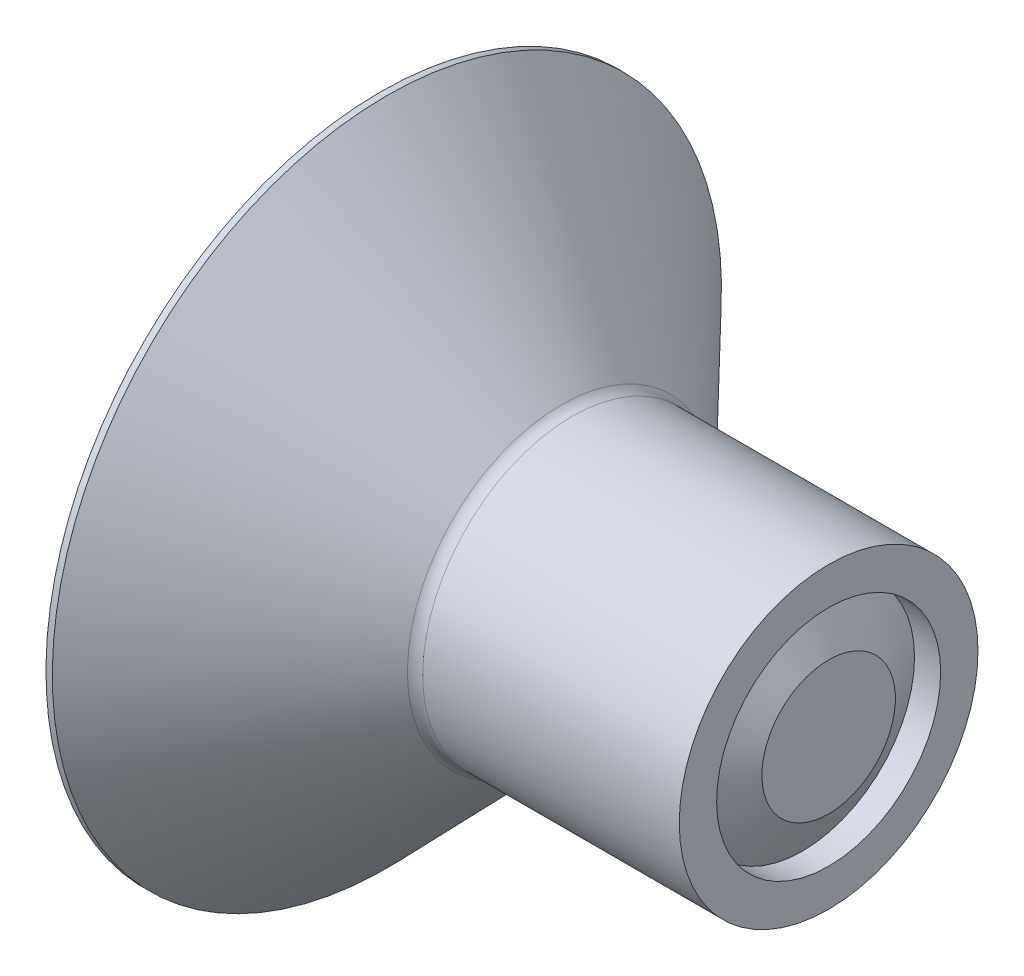
ISO-10303-21;
HEADER;
FILE_DESCRIPTION(('STEP AP214'),'2;1');
FILE_NAME('part.step','',(''),(''),'','','');
FILE_SCHEMA(('AUTOMOTIVE_DESIGN { 1 0 10303 214 1 1 1 1 }'));
ENDSEC;
DATA;
#1=APPLICATION_CONTEXT('core data for automotive mechanical design processes');
#2=APPLICATION_PROTOCOL_DEFINITION('international standard','automotive_design',2000,#1);
#3=PRODUCT_CONTEXT('',#1,'mechanical');
#4=PRODUCT('Part','Part','',(#3));
#5=PRODUCT_RELATED_PRODUCT_CATEGORY('part','',(#4));
#6=PRODUCT_DEFINITION_FORMATION('','',#4);
#7=PRODUCT_DEFINITION_CONTEXT('part definition',#1,'design');
#8=PRODUCT_DEFINITION('design','',#6,#7);
#9=PRODUCT_DEFINITION_SHAPE('','',#8);
#10=(LENGTH_UNIT() NAMED_UNIT(*) SI_UNIT(.MILLI.,.METRE.));
#11=(NAMED_UNIT(*) PLANE_ANGLE_UNIT() SI_UNIT($,.RADIAN.));
#12=(NAMED_UNIT(*) SI_UNIT($,.STERADIAN.) SOLID_ANGLE_UNIT());
#13=UNCERTAINTY_MEASURE_WITH_UNIT(LENGTH_MEASURE(1.E-05),#10,'distance_accuracy_value','');
#14=(GEOMETRIC_REPRESENTATION_CONTEXT(3) GLOBAL_UNCERTAINTY_ASSIGNED_CONTEXT((#13)) GLOBAL_UNIT_ASSIGNED_CONTEXT((#10,
#11,#12)) REPRESENTATION_CONTEXT('',''));
#15=CARTESIAN_POINT('',(0.,0.,0.));
#16=DIRECTION('',(0.,0.,1.));
#17=DIRECTION('',(1.,0.,0.));
#18=AXIS2_PLACEMENT_3D('',#15,#16,#17);
#19=CARTESIAN_POINT('',(0.,0.,0.));
#20=DIRECTION('',(1.,0.,0.));
#21=DIRECTION('',(0.,1.,0.));
#22=AXIS2_PLACEMENT_3D('',#19,#20,#21);
#23=PLANE('',#22);
#24=CARTESIAN_POINT('',(0.,0.,0.));
#25=DIRECTION('',(1.,0.,0.));
#26=DIRECTION('',(0.,1.,0.));
#27=AXIS2_PLACEMENT_3D('',#24,#25,#26);
#28=CIRCLE('',#27,2.);
#29=CARTESIAN_POINT('',(0.,2.,0.));
#30=VERTEX_POINT('',#29);
#31=EDGE_CURVE('E266',#30,#30,#28,.T.);
#32=ORIENTED_EDGE('',*,*,#31,.T.);
#33=EDGE_LOOP('',(#32));
#34=FACE_BOUND('',#33,.T.);
#35=CARTESIAN_POINT('',(0.,0.,0.));
#36=DIRECTION('',(1.,0.,0.));
#37=DIRECTION('',(0.,1.,0.));
#38=AXIS2_PLACEMENT_3D('',#35,#36,#37);
#39=CIRCLE('',#38,1.5);
#40=CARTESIAN_POINT('',(0.,1.5,0.));
#41=VERTEX_POINT('',#40);
#42=EDGE_CURVE('E40',#41,#41,#39,.F.);
#43=ORIENTED_EDGE('',*,*,#42,.T.);
#44=EDGE_LOOP('',(#43));
#45=FACE_BOUND('',#44,.T.);
#46=ADVANCED_FACE('F37',(#34,#45),#23,.T.);
#47=CARTESIAN_POINT('',(-6.,4.48,0.));
#48=DIRECTION('',(-1.,0.,0.));
#49=DIRECTION('',(0.,-1.,0.));
#50=AXIS2_PLACEMENT_3D('',#47,#48,#49);
#51=PLANE('',#50);
#52=CARTESIAN_POINT('',(-6.,0.,0.));
#53=DIRECTION('',(1.,0.,0.));
#54=DIRECTION('',(0.,1.,0.));
#55=AXIS2_PLACEMENT_3D('',#52,#53,#54);
#56=CIRCLE('',#55,4.48);
#57=CARTESIAN_POINT('',(-6.,4.48,0.));
#58=VERTEX_POINT('',#57);
#59=EDGE_CURVE('E45',#58,#58,#56,.T.);
#60=ORIENTED_EDGE('',*,*,#59,.F.);
#61=EDGE_LOOP('',(#60));
#62=FACE_BOUND('',#61,.T.);
#63=CARTESIAN_POINT('',(-6.,0.,0.));
#64=DIRECTION('',(-1.,0.,0.));
#65=DIRECTION('',(0.,-1.,0.));
#66=AXIS2_PLACEMENT_3D('',#63,#64,#65);
#67=CIRCLE('',#66,1.44337567297406);
#68=CARTESIAN_POINT('',(-6.,-1.44337567297407,0.));
#69=VERTEX_POINT('',#68);
#70=CARTESIAN_POINT('',(-6.,-0.721687836487035,1.25));
#71=VERTEX_POINT('',#70);
#72=EDGE_CURVE('E58',#69,#71,#67,.T.);
#73=ORIENTED_EDGE('',*,*,#72,.F.);
#74=CARTESIAN_POINT('',(-6.,-0.72168783648703,-1.25));
#75=VERTEX_POINT('',#74);
#76=EDGE_CURVE('E127',#75,#69,#67,.T.);
#77=ORIENTED_EDGE('',*,*,#76,.F.);
#78=CARTESIAN_POINT('',(-6.,0.721687836487032,-1.25));
#79=VERTEX_POINT('',#78);
#80=EDGE_CURVE('E126',#79,#75,#67,.T.);
#81=ORIENTED_EDGE('',*,*,#80,.F.);
#82=CARTESIAN_POINT('',(-6.,1.44337567297406,0.));
#83=VERTEX_POINT('',#82);
#84=EDGE_CURVE('E97',#83,#79,#67,.T.);
#85=ORIENTED_EDGE('',*,*,#84,.F.);
#86=CARTESIAN_POINT('',(-6.,0.721687836487031,1.25));
#87=VERTEX_POINT('',#86);
#88=EDGE_CURVE('E90',#87,#83,#67,.T.);
#89=ORIENTED_EDGE('',*,*,#88,.F.);
#90=EDGE_CURVE('E51',#71,#87,#67,.T.);
#91=ORIENTED_EDGE('',*,*,#90,.F.);
#92=EDGE_LOOP('',(#73,#77,#81,#85,#89,#91));
#93=FACE_BOUND('',#92,.T.);
#94=ADVANCED_FACE('F124',(#62,#93),#51,.T.);
#95=CARTESIAN_POINT('',(0.,0.,0.));
#96=DIRECTION('',(1.,0.,0.));
#97=DIRECTION('',(0.,1.,0.));
#98=AXIS2_PLACEMENT_3D('',#95,#96,#97);
#99=CYLINDRICAL_SURFACE('',#98,4.48);
#100=ORIENTED_EDGE('',*,*,#59,.T.);
#101=EDGE_LOOP('',(#100));
#102=FACE_BOUND('',#101,.T.);
#103=CARTESIAN_POINT('',(-5.91490816152153,0.,0.));
#104=DIRECTION('',(1.,0.,0.));
#105=DIRECTION('',(0.,1.,0.));
#106=AXIS2_PLACEMENT_3D('',#103,#104,#105);
#107=CIRCLE('',#106,4.48);
#108=CARTESIAN_POINT('',(-5.91490816152154,4.48,0.));
#109=VERTEX_POINT('',#108);
#110=EDGE_CURVE('E257',#109,#109,#107,.T.);
#111=ORIENTED_EDGE('',*,*,#110,.F.);
#112=EDGE_LOOP('',(#111));
#113=FACE_BOUND('',#112,.T.);
#114=ADVANCED_FACE('F203',(#102,#113),#99,.T.);
#115=CARTESIAN_POINT('',(-3.57897299682581,0.,0.));
#116=DIRECTION('',(-1.,0.,0.));
#117=DIRECTION('',(0.,-1.,0.));
#118=AXIS2_PLACEMENT_3D('',#115,#116,#117);
#119=CONICAL_SURFACE('',#118,2.0610683259082,0.802851455917393);
#120=ORIENTED_EDGE('',*,*,#110,.T.);
#121=EDGE_LOOP('',(#120));
#122=FACE_BOUND('',#121,.T.);
#123=CARTESIAN_POINT('',(-3.57897299682581,0.,0.));
#124=DIRECTION('',(1.,0.,0.));
#125=DIRECTION('',(0.,1.,0.));
#126=AXIS2_PLACEMENT_3D('',#123,#124,#125);
#127=CIRCLE('',#126,2.0610683259082);
#128=CARTESIAN_POINT('',(-3.57897299682581,2.0610683259082,0.));
#129=VERTEX_POINT('',#128);
#130=EDGE_CURVE('E258',#129,#129,#127,.T.);
#131=ORIENTED_EDGE('',*,*,#130,.F.);
#132=EDGE_LOOP('',(#131));
#133=FACE_BOUND('',#132,.T.);
#134=ADVANCED_FACE('F243',(#122,#133),#119,.T.);
#135=CARTESIAN_POINT('',(-3.43510503675808,0.,0.));
#136=DIRECTION('',(1.,0.,0.));
#137=DIRECTION('',(0.,1.,0.));
#138=AXIS2_PLACEMENT_3D('',#135,#136,#137);
#139=TOROIDAL_SURFACE('',#138,2.2,0.2);
#140=ORIENTED_EDGE('',*,*,#130,.T.);
#141=EDGE_LOOP('',(#140));
#142=FACE_BOUND('',#141,.T.);
#143=CARTESIAN_POINT('',(-3.43510503675808,0.,0.));
#144=DIRECTION('',(1.,0.,0.));
#145=DIRECTION('',(0.,1.,0.));
#146=AXIS2_PLACEMENT_3D('',#143,#144,#145);
#147=CIRCLE('',#146,2.);
#148=CARTESIAN_POINT('',(-3.43510503675808,2.,0.));
#149=VERTEX_POINT('',#148);
#150=EDGE_CURVE('E261',#149,#149,#147,.T.);
#151=ORIENTED_EDGE('',*,*,#150,.F.);
#152=EDGE_LOOP('',(#151));
#153=FACE_BOUND('',#152,.T.);
#154=ADVANCED_FACE('F239',(#142,#153),#139,.F.);
#155=CARTESIAN_POINT('',(0.,0.,0.));
#156=DIRECTION('',(1.,0.,0.));
#157=DIRECTION('',(0.,1.,0.));
#158=AXIS2_PLACEMENT_3D('',#155,#156,#157);
#159=CYLINDRICAL_SURFACE('',#158,2.);
#160=ORIENTED_EDGE('',*,*,#150,.T.);
#161=EDGE_LOOP('',(#160));
#162=FACE_BOUND('',#161,.T.);
#163=ORIENTED_EDGE('',*,*,#31,.F.);
#164=EDGE_LOOP('',(#163));
#165=FACE_BOUND('',#164,.T.);
#166=ADVANCED_FACE('F236',(#162,#165),#159,.T.);
#167=CARTESIAN_POINT('',(-5.67,0.,0.));
#168=DIRECTION('',(-1.,0.,0.));
#169=DIRECTION('',(0.,-1.,0.));
#170=AXIS2_PLACEMENT_3D('',#167,#168,#169);
#171=CONICAL_SURFACE('',#170,0.,1.346028824285);
#172=CARTESIAN_POINT('',(-6.00002640316775,0.721572366433194,-1.2502));
#173=CARTESIAN_POINT('',(-5.99316164915086,0.751578919742522,-1.19822712510822));
#174=CARTESIAN_POINT('',(-5.98693359577069,0.781625278593417,-1.14618530499602));
#175=CARTESIAN_POINT('',(-5.9759962682397,0.841795337667883,-1.04196770558463));
#176=CARTESIAN_POINT('',(-5.97128743720538,0.871919057877979,-0.989791891667751));
#177=CARTESIAN_POINT('',(-5.96365263124468,0.932110463409816,-0.885537319107627));
#178=CARTESIAN_POINT('',(-5.96072000591496,0.962177932232898,-0.833458935451056));
#179=CARTESIAN_POINT('',(-5.95678801595998,1.02234085525416,-0.729253696046381));
#180=CARTESIAN_POINT('',(-5.95578838324886,1.05243630499235,-0.677126848023191));
#181=CARTESIAN_POINT('',(-5.95578838324886,1.11262720446874,-0.57287315197681));
#182=CARTESIAN_POINT('',(-5.95678801595998,1.14272265420694,-0.52074630395362));
#183=CARTESIAN_POINT('',(-5.96072000591496,1.2028855772282,-0.416541064548944));
#184=CARTESIAN_POINT('',(-5.96365263124468,1.23295304605128,-0.364462680892373));
#185=CARTESIAN_POINT('',(-5.97128743720538,1.29314445158312,-0.26020810833225));
#186=CARTESIAN_POINT('',(-5.9759962682397,1.32326817179321,-0.208032294415374));
#187=CARTESIAN_POINT('',(-5.98693359577069,1.38343823086768,-0.103814695003977));
#188=CARTESIAN_POINT('',(-5.99316164915086,1.41348458971857,-0.0517728748917802));
#189=CARTESIAN_POINT('',(-6.00002640316775,1.4434911430279,0.000199999999999778));
#190=B_SPLINE_CURVE_WITH_KNOTS('',3,(#172,#173,#174,#175,#176,#177,#178,#179,#180,#181,#182,
#183,#184,#185,#186,#187,#188,#189),.UNSPECIFIED.,.F.,.F.,(4,2,2,2,2,2,2,2,4),(0.,
0.181220121181788,0.36249305173663,0.543083002252857,0.723647905035905,0.904212807818953,
1.08480275833518,1.26607568889002,1.44729581007181),.UNSPECIFIED.);
#191=EDGE_CURVE('E11',#79,#83,#190,.T.);
#192=ORIENTED_EDGE('',*,*,#191,.T.);
#193=ORIENTED_EDGE('',*,*,#84,.T.);
#194=EDGE_LOOP('',(#192,#193));
#195=FACE_BOUND('',#194,.T.);
#196=ADVANCED_FACE('F102',(#195),#171,.F.);
#197=CARTESIAN_POINT('',(-6.18793036254324,-1.88927132014938,-1.25));
#198=CARTESIAN_POINT('',(-6.17715485168872,-1.83274947394636,-1.25));
#199=CARTESIAN_POINT('',(-6.16651770285504,-1.77620124735624,-1.25));
#200=CARTESIAN_POINT('',(-6.14558964918611,-1.66303890380402,-1.25));
#201=CARTESIAN_POINT('',(-6.13529875578279,-1.60642478473015,-1.25));
#202=CARTESIAN_POINT('',(-6.10503611735938,-1.43638698144466,-1.25));
#203=CARTESIAN_POINT('',(-6.08569031190507,-1.32285013852453,-1.25));
#204=CARTESIAN_POINT('',(-6.04964038441761,-1.09606337686776,-1.25));
#205=CARTESIAN_POINT('',(-6.0329208047333,-0.982815961554098,-1.25));
#206=CARTESIAN_POINT('',(-6.00329125505211,-0.755823057680256,-1.25));
#207=CARTESIAN_POINT('',(-5.99038073612435,-0.642077643287695,-1.25));
#208=CARTESIAN_POINT('',(-5.97002649614414,-0.413149525872156,-1.25));
#209=CARTESIAN_POINT('',(-5.96262742015456,-0.297962609964413,-1.25));
#210=CARTESIAN_POINT('',(-5.95502013613961,-0.0673717671612563,-1.25));
#211=CARTESIAN_POINT('',(-5.95480947049746,0.0480320720763855,-1.25));
#212=CARTESIAN_POINT('',(-5.96163530797985,0.278945083856296,-1.25));
#213=CARTESIAN_POINT('',(-5.96869297879331,0.394453579666144,-1.25));
#214=CARTESIAN_POINT('',(-5.98857966081613,0.624999808918754,-1.25));
#215=CARTESIAN_POINT('',(-6.00141157390405,0.740037276274113,-1.25));
#216=CARTESIAN_POINT('',(-6.03114369156296,0.970434091749315,-1.25));
#217=CARTESIAN_POINT('',(-6.04807337367262,1.08578949564192,-1.25));
#218=CARTESIAN_POINT('',(-6.08455420374337,1.31608998297647,-1.25));
#219=CARTESIAN_POINT('',(-6.10410565336245,1.431035017637,-1.25));
#220=CARTESIAN_POINT('',(-6.14492717089819,1.66064354580432,-1.25));
#221=CARTESIAN_POINT('',(-6.16619763756512,1.77530696759454,-1.25));
#222=CARTESIAN_POINT('',(-6.20988797594902,2.00441505440381,-1.25));
#223=CARTESIAN_POINT('',(-6.23230786643129,2.11885971581975,-1.25));
#224=CARTESIAN_POINT('',(-6.27774897759753,2.34662588066722,-1.25));
#225=CARTESIAN_POINT('',(-6.30076353540629,2.45994871899744,-1.25));
#226=CARTESIAN_POINT('',(-6.34735063712916,2.68648127335843,-1.25));
#227=CARTESIAN_POINT('',(-6.37092319012281,2.79969098751718,-1.25));
#228=CARTESIAN_POINT('',(-6.41845052994077,3.0259043321992,-1.25));
#229=CARTESIAN_POINT('',(-6.44240488385377,3.13890805386907,-1.25));
#230=CARTESIAN_POINT('',(-6.49062484328637,3.36484594157774,-1.25));
#231=CARTESIAN_POINT('',(-6.51489044042642,3.4777801094037,-1.25));
#232=CARTESIAN_POINT('',(-6.53926461234782,3.59069056542225,-1.25));
#233=B_SPLINE_CURVE_WITH_KNOTS('',3,(#197,#198,#199,#200,#201,#202,#203,#204,#205,#206,#207,
#208,#209,#210,#211,#212,#213,#214,#215,#216,#217,#218,#219,#220,#221,#222,#223,#224,#225,#226,
#227,#228,#229,#230,#231,#232),.UNSPECIFIED.,.F.,.F.,(4,2,2,2,2,2,2,2,2,2,2,2,2,2,2,2,2,4),(0.,
0.172619061291276,0.345243816164298,0.690744733905591,1.03412901165595,1.37746377945508,
1.72355033325605,2.06951856372716,2.41649721998441,2.76365044743721,3.11337930966454,
3.46314844593415,3.81299895025842,4.16285516800416,4.50976195696431,4.85667439458757,
5.2032180960064,5.54975248699939),.UNSPECIFIED.);
#234=EDGE_CURVE('E130',#75,#79,#233,.T.);
#235=ORIENTED_EDGE('',*,*,#234,.T.);
#236=ORIENTED_EDGE('',*,*,#80,.T.);
#237=EDGE_LOOP('',(#235,#236));
#238=FACE_BOUND('',#237,.T.);
#239=ADVANCED_FACE('F301',(#238),#171,.F.);
#240=CARTESIAN_POINT('',(-6.00002640316775,-1.4434911430279,0.000199999999999897));
#241=CARTESIAN_POINT('',(-5.99316164915086,-1.41348458971858,-0.0517728748917799));
#242=CARTESIAN_POINT('',(-5.98693359577068,-1.38343823086768,-0.103814695003977));
#243=CARTESIAN_POINT('',(-5.9759962682397,-1.32326817179321,-0.208032294415374));
#244=CARTESIAN_POINT('',(-5.97128743720538,-1.29314445158312,-0.26020810833225));
#245=CARTESIAN_POINT('',(-5.96365263124468,-1.23295304605128,-0.364462680892373));
#246=CARTESIAN_POINT('',(-5.96072000591496,-1.2028855772282,-0.416541064548944));
#247=CARTESIAN_POINT('',(-5.95678801595998,-1.14272265420694,-0.52074630395362));
#248=CARTESIAN_POINT('',(-5.95578838324886,-1.11262720446874,-0.57287315197681));
#249=CARTESIAN_POINT('',(-5.95578838324886,-1.05243630499235,-0.67712684802319));
#250=CARTESIAN_POINT('',(-5.95678801595998,-1.02234085525416,-0.72925369604638));
#251=CARTESIAN_POINT('',(-5.96072000591496,-0.962177932232899,-0.833458935451056));
#252=CARTESIAN_POINT('',(-5.96365263124468,-0.932110463409817,-0.885537319107627));
#253=CARTESIAN_POINT('',(-5.97128743720538,-0.871919057877981,-0.98979189166775));
#254=CARTESIAN_POINT('',(-5.9759962682397,-0.841795337667884,-1.04196770558463));
#255=CARTESIAN_POINT('',(-5.98693359577068,-0.781625278593418,-1.14618530499602));
#256=CARTESIAN_POINT('',(-5.99316164915086,-0.751578919742523,-1.19822712510822));
#257=CARTESIAN_POINT('',(-6.00002640316775,-0.721572366433195,-1.2502));
#258=B_SPLINE_CURVE_WITH_KNOTS('',3,(#240,#241,#242,#243,#244,#245,#246,#247,#248,#249,#250,
#251,#252,#253,#254,#255,#256,#257),.UNSPECIFIED.,.F.,.F.,(4,2,2,2,2,2,2,2,4),(0.,
0.181220121181788,0.36249305173663,0.543083002252857,0.723647905035905,0.904212807818953,
1.08480275833518,1.26607568889002,1.44729581007181),.UNSPECIFIED.);
#259=EDGE_CURVE('E139',#69,#75,#258,.T.);
#260=ORIENTED_EDGE('',*,*,#259,.T.);
#261=ORIENTED_EDGE('',*,*,#76,.T.);
#262=EDGE_LOOP('',(#260,#261));
#263=FACE_BOUND('',#262,.T.);
#264=ADVANCED_FACE('F297',(#263),#171,.F.);
#265=CARTESIAN_POINT('',(-6.00002640316775,-0.721572366433196,1.2502));
#266=CARTESIAN_POINT('',(-5.99316164915086,-0.751578919742524,1.19822712510822));
#267=CARTESIAN_POINT('',(-5.98693359577068,-0.781625278593419,1.14618530499602));
#268=CARTESIAN_POINT('',(-5.9759962682397,-0.841795337667885,1.04196770558463));
#269=CARTESIAN_POINT('',(-5.97128743720538,-0.871919057877981,0.98979189166775));
#270=CARTESIAN_POINT('',(-5.96365263124468,-0.932110463409818,0.885537319107626));
#271=CARTESIAN_POINT('',(-5.96072000591496,-0.9621779322329,0.833458935451056));
#272=CARTESIAN_POINT('',(-5.95678801595998,-1.02234085525416,0.72925369604638));
#273=CARTESIAN_POINT('',(-5.95578838324886,-1.05243630499235,0.67712684802319));
#274=CARTESIAN_POINT('',(-5.95578838324886,-1.11262720446875,0.572873151976809));
#275=CARTESIAN_POINT('',(-5.95678801595998,-1.14272265420694,0.520746303953619));
#276=CARTESIAN_POINT('',(-5.96072000591496,-1.2028855772282,0.416541064548944));
#277=CARTESIAN_POINT('',(-5.96365263124468,-1.23295304605128,0.364462680892373));
#278=CARTESIAN_POINT('',(-5.97128743720538,-1.29314445158312,0.260208108332249));
#279=CARTESIAN_POINT('',(-5.9759962682397,-1.32326817179321,0.208032294415374));
#280=CARTESIAN_POINT('',(-5.98693359577068,-1.38343823086768,0.103814695003977));
#281=CARTESIAN_POINT('',(-5.99316164915086,-1.41348458971858,0.0517728748917797));
#282=CARTESIAN_POINT('',(-6.00002640316775,-1.4434911430279,-0.000200000000000134));
#283=B_SPLINE_CURVE_WITH_KNOTS('',3,(#265,#266,#267,#268,#269,#270,#271,#272,#273,#274,#275,
#276,#277,#278,#279,#280,#281,#282),.UNSPECIFIED.,.F.,.F.,(4,2,2,2,2,2,2,2,4),(0.,
0.181220121181788,0.36249305173663,0.543083002252857,0.723647905035905,0.904212807818953,
1.08480275833518,1.26607568889002,1.44729581007181),.UNSPECIFIED.);
#284=EDGE_CURVE('E166',#71,#69,#283,.T.);
#285=ORIENTED_EDGE('',*,*,#284,.T.);
#286=ORIENTED_EDGE('',*,*,#72,.T.);
#287=EDGE_LOOP('',(#285,#286));
#288=FACE_BOUND('',#287,.T.);
#289=ADVANCED_FACE('F307',(#288),#171,.F.);
#290=CARTESIAN_POINT('',(-6.18793036254324,-1.88927132014938,1.25));
#291=CARTESIAN_POINT('',(-6.17715485168872,-1.83274947394636,1.25));
#292=CARTESIAN_POINT('',(-6.16651770285504,-1.77620124735624,1.25));
#293=CARTESIAN_POINT('',(-6.14558964918611,-1.66303890380402,1.25));
#294=CARTESIAN_POINT('',(-6.13529875578279,-1.60642478473015,1.25));
#295=CARTESIAN_POINT('',(-6.10503611735938,-1.43638698144466,1.25));
#296=CARTESIAN_POINT('',(-6.08569031190507,-1.32285013852453,1.25));
#297=CARTESIAN_POINT('',(-6.04964038441761,-1.09606337686776,1.25));
#298=CARTESIAN_POINT('',(-6.03292080473329,-0.982815961554098,1.25));
#299=CARTESIAN_POINT('',(-6.00329125505211,-0.755823057680256,1.25));
#300=CARTESIAN_POINT('',(-5.99038073612435,-0.642077643287696,1.25));
#301=CARTESIAN_POINT('',(-5.97002649614414,-0.413149525872157,1.25));
#302=CARTESIAN_POINT('',(-5.96262742015456,-0.297962609964414,1.25));
#303=CARTESIAN_POINT('',(-5.95502013613961,-0.0673717671612571,1.25));
#304=CARTESIAN_POINT('',(-5.95480947049746,0.0480320720763846,1.25));
#305=CARTESIAN_POINT('',(-5.96163530797985,0.278945083856295,1.25));
#306=CARTESIAN_POINT('',(-5.9686929787933,0.394453579666143,1.25));
#307=CARTESIAN_POINT('',(-5.98857966081613,0.624999808918753,1.25));
#308=CARTESIAN_POINT('',(-6.00141157390405,0.740037276274112,1.25));
#309=CARTESIAN_POINT('',(-6.03114369156296,0.970434091749314,1.25));
#310=CARTESIAN_POINT('',(-6.04807337367262,1.08578949564192,1.25));
#311=CARTESIAN_POINT('',(-6.08455420374337,1.31608998297647,1.25));
#312=CARTESIAN_POINT('',(-6.10410565336245,1.431035017637,1.25));
#313=CARTESIAN_POINT('',(-6.14492717089818,1.66064354580432,1.25));
#314=CARTESIAN_POINT('',(-6.16619763756512,1.77530696759454,1.25));
#315=CARTESIAN_POINT('',(-6.20988797594902,2.00441505440381,1.25));
#316=CARTESIAN_POINT('',(-6.23230786643129,2.11885971581975,1.25));
#317=CARTESIAN_POINT('',(-6.27774897759753,2.34662588066722,1.25));
#318=CARTESIAN_POINT('',(-6.30076353540629,2.45994871899744,1.25));
#319=CARTESIAN_POINT('',(-6.34735063712916,2.68648127335843,1.25));
#320=CARTESIAN_POINT('',(-6.37092319012281,2.79969098751718,1.25));
#321=CARTESIAN_POINT('',(-6.41845052994077,3.0259043321992,1.25));
#322=CARTESIAN_POINT('',(-6.44240488385377,3.13890805386907,1.25));
#323=CARTESIAN_POINT('',(-6.49062484328637,3.36484594157774,1.25));
#324=CARTESIAN_POINT('',(-6.51489044042642,3.4777801094037,1.25));
#325=CARTESIAN_POINT('',(-6.53926461234782,3.59069056542225,1.25));
#326=B_SPLINE_CURVE_WITH_KNOTS('',3,(#290,#291,#292,#293,#294,#295,#296,#297,#298,#299,#300,
#301,#302,#303,#304,#305,#306,#307,#308,#309,#310,#311,#312,#313,#314,#315,#316,#317,#318,#319,
#320,#321,#322,#323,#324,#325),.UNSPECIFIED.,.F.,.F.,(4,2,2,2,2,2,2,2,2,2,2,2,2,2,2,2,2,4),(0.,
0.172619061291276,0.345243816164298,0.690744733905592,1.03412901165595,1.37746377945508,
1.72355033325605,2.06951856372716,2.41649721998441,2.76365044743721,3.11337930966454,
3.46314844593415,3.81299895025842,4.16285516800416,4.50976195696431,4.85667439458757,
5.2032180960064,5.54975248699939),.UNSPECIFIED.);
#327=EDGE_CURVE('E114',#87,#71,#326,.F.);
#328=ORIENTED_EDGE('',*,*,#327,.T.);
#329=ORIENTED_EDGE('',*,*,#90,.T.);
#330=EDGE_LOOP('',(#328,#329));
#331=FACE_BOUND('',#330,.T.);
#332=ADVANCED_FACE('F153',(#331),#171,.F.);
#333=CARTESIAN_POINT('',(-6.00002640316775,1.4434911430279,-0.000200000000000113));
#334=CARTESIAN_POINT('',(-5.99316164915086,1.41348458971857,0.0517728748917798));
#335=CARTESIAN_POINT('',(-5.98693359577069,1.38343823086768,0.103814695003977));
#336=CARTESIAN_POINT('',(-5.9759962682397,1.32326817179321,0.208032294415373));
#337=CARTESIAN_POINT('',(-5.97128743720538,1.29314445158312,0.260208108332249));
#338=CARTESIAN_POINT('',(-5.96365263124468,1.23295304605128,0.364462680892373));
#339=CARTESIAN_POINT('',(-5.96072000591496,1.2028855772282,0.416541064548944));
#340=CARTESIAN_POINT('',(-5.95678801595998,1.14272265420694,0.520746303953619));
#341=CARTESIAN_POINT('',(-5.95578838324886,1.11262720446874,0.57287315197681));
#342=CARTESIAN_POINT('',(-5.95578838324886,1.05243630499235,0.67712684802319));
#343=CARTESIAN_POINT('',(-5.95678801595998,1.02234085525416,0.72925369604638));
#344=CARTESIAN_POINT('',(-5.96072000591496,0.962177932232898,0.833458935451055));
#345=CARTESIAN_POINT('',(-5.96365263124468,0.932110463409816,0.885537319107626));
#346=CARTESIAN_POINT('',(-5.97128743720538,0.87191905787798,0.98979189166775));
#347=CARTESIAN_POINT('',(-5.9759962682397,0.841795337667884,1.04196770558463));
#348=CARTESIAN_POINT('',(-5.98693359577069,0.781625278593417,1.14618530499602));
#349=CARTESIAN_POINT('',(-5.99316164915086,0.751578919742522,1.19822712510822));
#350=CARTESIAN_POINT('',(-6.00002640316775,0.721572366433194,1.2502));
#351=B_SPLINE_CURVE_WITH_KNOTS('',3,(#333,#334,#335,#336,#337,#338,#339,#340,#341,#342,#343,
#344,#345,#346,#347,#348,#349,#350),.UNSPECIFIED.,.F.,.F.,(4,2,2,2,2,2,2,2,4),(0.,
0.181220121181788,0.36249305173663,0.543083002252857,0.723647905035905,0.904212807818953,
1.08480275833518,1.26607568889002,1.44729581007181),.UNSPECIFIED.);
#352=EDGE_CURVE('E93',#83,#87,#351,.T.);
#353=ORIENTED_EDGE('',*,*,#352,.T.);
#354=ORIENTED_EDGE('',*,*,#88,.T.);
#355=EDGE_LOOP('',(#353,#354));
#356=FACE_BOUND('',#355,.T.);
#357=ADVANCED_FACE('F91',(#356),#171,.F.);
#358=CARTESIAN_POINT('',(-4.04,0.721687836487032,1.25));
#359=DIRECTION('',(1.,0.,0.));
#360=DIRECTION('',(0.,0.,-1.));
#361=AXIS2_PLACEMENT_3D('',#358,#359,#360);
#362=PLANE('',#361);
#363=DIRECTION('',(0.,0.5,-0.866025403784439));
#364=VECTOR('',#363,1.);
#365=CARTESIAN_POINT('',(-4.04,0.721687836487032,1.25));
#366=LINE('',#365,#364);
#367=CARTESIAN_POINT('',(-4.04,0.721687836487032,1.25));
#368=VERTEX_POINT('',#367);
#369=CARTESIAN_POINT('',(-4.04,1.44337567297406,0.));
#370=VERTEX_POINT('',#369);
#371=EDGE_CURVE('E113',#368,#370,#366,.T.);
#372=ORIENTED_EDGE('',*,*,#371,.T.);
#373=DIRECTION('',(0.,-0.5,-0.866025403784439));
#374=VECTOR('',#373,1.);
#375=CARTESIAN_POINT('',(-4.04,1.44337567297406,0.));
#376=LINE('',#375,#374);
#377=CARTESIAN_POINT('',(-4.04,0.721687836487032,-1.25));
#378=VERTEX_POINT('',#377);
#379=EDGE_CURVE('E118',#370,#378,#376,.T.);
#380=ORIENTED_EDGE('',*,*,#379,.T.);
#381=DIRECTION('',(0.,-1.,0.));
#382=VECTOR('',#381,1.);
#383=CARTESIAN_POINT('',(-4.04,0.721687836487032,-1.25));
#384=LINE('',#383,#382);
#385=CARTESIAN_POINT('',(-4.04,-0.721687836487033,-1.25));
#386=VERTEX_POINT('',#385);
#387=EDGE_CURVE('E286',#378,#386,#384,.T.);
#388=ORIENTED_EDGE('',*,*,#387,.T.);
#389=DIRECTION('',(0.,-0.5,0.866025403784439));
#390=VECTOR('',#389,1.);
#391=CARTESIAN_POINT('',(-4.04,-0.721687836487033,-1.25));
#392=LINE('',#391,#390);
#393=CARTESIAN_POINT('',(-4.04,-1.44337567297406,0.));
#394=VERTEX_POINT('',#393);
#395=EDGE_CURVE('E283',#386,#394,#392,.T.);
#396=ORIENTED_EDGE('',*,*,#395,.T.);
#397=DIRECTION('',(0.,0.5,0.866025403784439));
#398=VECTOR('',#397,1.);
#399=CARTESIAN_POINT('',(-4.04,-1.44337567297406,0.));
#400=LINE('',#399,#398);
#401=CARTESIAN_POINT('',(-4.04,-0.721687836487033,1.25));
#402=VERTEX_POINT('',#401);
#403=EDGE_CURVE('E280',#394,#402,#400,.T.);
#404=ORIENTED_EDGE('',*,*,#403,.T.);
#405=DIRECTION('',(0.,1.,0.));
#406=VECTOR('',#405,1.);
#407=CARTESIAN_POINT('',(-4.04,-0.721687836487033,1.25));
#408=LINE('',#407,#406);
#409=EDGE_CURVE('E121',#402,#368,#408,.T.);
#410=ORIENTED_EDGE('',*,*,#409,.T.);
#411=EDGE_LOOP('',(#372,#380,#388,#396,#404,#410));
#412=FACE_BOUND('',#411,.T.);
#413=ADVANCED_FACE('F152',(#412),#362,.F.);
#414=CARTESIAN_POINT('',(-4.04,1.44337567297406,0.));
#415=DIRECTION('',(0.,0.866025403784439,-0.5));
#416=DIRECTION('',(0.,0.5,0.866025403784439));
#417=AXIS2_PLACEMENT_3D('',#414,#415,#416);
#418=PLANE('',#417);
#419=ORIENTED_EDGE('',*,*,#191,.F.);
#420=DIRECTION('',(-1.,0.,0.));
#421=VECTOR('',#420,1.);
#422=CARTESIAN_POINT('',(-4.04,0.721687836487032,-1.25));
#423=LINE('',#422,#421);
#424=EDGE_CURVE('E120',#378,#79,#423,.T.);
#425=ORIENTED_EDGE('',*,*,#424,.F.);
#426=ORIENTED_EDGE('',*,*,#379,.F.);
#427=DIRECTION('',(-1.,0.,0.));
#428=VECTOR('',#427,1.);
#429=CARTESIAN_POINT('',(-4.04,1.44337567297406,0.));
#430=LINE('',#429,#428);
#431=EDGE_CURVE('E110',#370,#83,#430,.T.);
#432=ORIENTED_EDGE('',*,*,#431,.T.);
#433=EDGE_LOOP('',(#419,#425,#426,#432));
#434=FACE_BOUND('',#433,.T.);
#435=ADVANCED_FACE('F116',(#434),#418,.F.);
#436=CARTESIAN_POINT('',(-4.04,0.721687836487032,-1.25));
#437=DIRECTION('',(0.,0.,-1.));
#438=DIRECTION('',(-1.,0.,0.));
#439=AXIS2_PLACEMENT_3D('',#436,#437,#438);
#440=PLANE('',#439);
#441=ORIENTED_EDGE('',*,*,#234,.F.);
#442=DIRECTION('',(-1.,0.,0.));
#443=VECTOR('',#442,1.);
#444=CARTESIAN_POINT('',(-4.04,-0.721687836487033,-1.25));
#445=LINE('',#444,#443);
#446=EDGE_CURVE('E269',#386,#75,#445,.T.);
#447=ORIENTED_EDGE('',*,*,#446,.F.);
#448=ORIENTED_EDGE('',*,*,#387,.F.);
#449=ORIENTED_EDGE('',*,*,#424,.T.);
#450=EDGE_LOOP('',(#441,#447,#448,#449));
#451=FACE_BOUND('',#450,.T.);
#452=ADVANCED_FACE('F145',(#451),#440,.F.);
#453=CARTESIAN_POINT('',(-4.04,-0.721687836487033,-1.25));
#454=DIRECTION('',(0.,-0.866025403784438,-0.5));
#455=DIRECTION('',(0.,0.5,-0.866025403784439));
#456=AXIS2_PLACEMENT_3D('',#453,#454,#455);
#457=PLANE('',#456);
#458=ORIENTED_EDGE('',*,*,#259,.F.);
#459=DIRECTION('',(-1.,0.,0.));
#460=VECTOR('',#459,1.);
#461=CARTESIAN_POINT('',(-4.04,-1.44337567297406,0.));
#462=LINE('',#461,#460);
#463=EDGE_CURVE('E272',#394,#69,#462,.T.);
#464=ORIENTED_EDGE('',*,*,#463,.F.);
#465=ORIENTED_EDGE('',*,*,#395,.F.);
#466=ORIENTED_EDGE('',*,*,#446,.T.);
#467=EDGE_LOOP('',(#458,#464,#465,#466));
#468=FACE_BOUND('',#467,.T.);
#469=ADVANCED_FACE('F187',(#468),#457,.F.);
#470=CARTESIAN_POINT('',(-4.04,-1.44337567297406,0.));
#471=DIRECTION('',(0.,-0.866025403784439,0.5));
#472=DIRECTION('',(0.,-0.5,-0.866025403784439));
#473=AXIS2_PLACEMENT_3D('',#470,#471,#472);
#474=PLANE('',#473);
#475=ORIENTED_EDGE('',*,*,#284,.F.);
#476=DIRECTION('',(-1.,0.,0.));
#477=VECTOR('',#476,1.);
#478=CARTESIAN_POINT('',(-4.04,-0.721687836487033,1.25));
#479=LINE('',#478,#477);
#480=EDGE_CURVE('E274',#402,#71,#479,.T.);
#481=ORIENTED_EDGE('',*,*,#480,.F.);
#482=ORIENTED_EDGE('',*,*,#403,.F.);
#483=ORIENTED_EDGE('',*,*,#463,.T.);
#484=EDGE_LOOP('',(#475,#481,#482,#483));
#485=FACE_BOUND('',#484,.T.);
#486=ADVANCED_FACE('F183',(#485),#474,.F.);
#487=CARTESIAN_POINT('',(-4.04,-0.721687836487033,1.25));
#488=DIRECTION('',(0.,0.,1.));
#489=DIRECTION('',(0.,-1.,0.));
#490=AXIS2_PLACEMENT_3D('',#487,#488,#489);
#491=PLANE('',#490);
#492=ORIENTED_EDGE('',*,*,#327,.F.);
#493=DIRECTION('',(-1.,0.,0.));
#494=VECTOR('',#493,1.);
#495=CARTESIAN_POINT('',(-4.04,0.721687836487032,1.25));
#496=LINE('',#495,#494);
#497=EDGE_CURVE('E112',#368,#87,#496,.T.);
#498=ORIENTED_EDGE('',*,*,#497,.F.);
#499=ORIENTED_EDGE('',*,*,#409,.F.);
#500=ORIENTED_EDGE('',*,*,#480,.T.);
#501=EDGE_LOOP('',(#492,#498,#499,#500));
#502=FACE_BOUND('',#501,.T.);
#503=ADVANCED_FACE('F180',(#502),#491,.F.);
#504=CARTESIAN_POINT('',(-4.04,0.721687836487032,1.25));
#505=DIRECTION('',(0.,0.866025403784439,0.5));
#506=DIRECTION('',(0.,-0.5,0.866025403784439));
#507=AXIS2_PLACEMENT_3D('',#504,#505,#506);
#508=PLANE('',#507);
#509=ORIENTED_EDGE('',*,*,#352,.F.);
#510=ORIENTED_EDGE('',*,*,#431,.F.);
#511=ORIENTED_EDGE('',*,*,#371,.F.);
#512=ORIENTED_EDGE('',*,*,#497,.T.);
#513=EDGE_LOOP('',(#509,#510,#511,#512));
#514=FACE_BOUND('',#513,.T.);
#515=ADVANCED_FACE('F108',(#514),#508,.F.);
#516=CARTESIAN_POINT('',(-0.35,0.,0.));
#517=DIRECTION('',(-1.,0.,0.));
#518=DIRECTION('',(0.,0.,1.));
#519=AXIS2_PLACEMENT_3D('',#516,#517,#518);
#520=CYLINDRICAL_SURFACE('',#519,1.5);
#521=ORIENTED_EDGE('',*,*,#42,.F.);
#522=EDGE_LOOP('',(#521));
#523=FACE_BOUND('',#522,.T.);
#524=CARTESIAN_POINT('',(-0.35,0.,0.));
#525=DIRECTION('',(-1.,0.,0.));
#526=DIRECTION('',(0.,0.,1.));
#527=AXIS2_PLACEMENT_3D('',#524,#525,#526);
#528=CIRCLE('',#527,1.5);
#529=CARTESIAN_POINT('',(-0.35,0.,1.5));
#530=VERTEX_POINT('',#529);
#531=EDGE_CURVE('E217',#530,#530,#528,.T.);
#532=ORIENTED_EDGE('',*,*,#531,.T.);
#533=EDGE_LOOP('',(#532));
#534=FACE_BOUND('',#533,.T.);
#535=ADVANCED_FACE('F154',(#523,#534),#520,.F.);
#536=CARTESIAN_POINT('',(-0.35,0.,0.));
#537=DIRECTION('',(-1.,0.,0.));
#538=DIRECTION('',(0.,0.,1.));
#539=AXIS2_PLACEMENT_3D('',#536,#537,#538);
#540=CONICAL_SURFACE('',#539,1.5,1.0471975511966);
#541=CARTESIAN_POINT('',(0.,0.,0.));
#542=DIRECTION('',(-1.,0.,0.));
#543=DIRECTION('',(0.,0.,1.));
#544=AXIS2_PLACEMENT_3D('',#541,#542,#543);
#545=CIRCLE('',#544,0.893782217350893);
#546=CARTESIAN_POINT('',(0.,0.,0.893782217350893));
#547=VERTEX_POINT('',#546);
#548=EDGE_CURVE('E131',#547,#547,#545,.T.);
#549=ORIENTED_EDGE('',*,*,#548,.T.);
#550=EDGE_LOOP('',(#549));
#551=FACE_BOUND('',#550,.T.);
#552=ORIENTED_EDGE('',*,*,#531,.F.);
#553=EDGE_LOOP('',(#552));
#554=FACE_BOUND('',#553,.T.);
#555=ADVANCED_FACE('F208',(#551,#554),#540,.T.);
#556=ORIENTED_EDGE('',*,*,#548,.F.);
#557=EDGE_LOOP('',(#556));
#558=FACE_BOUND('',#557,.T.);
#559=ADVANCED_FACE('F199',(#558),#23,.T.);
#560=CLOSED_SHELL('',(#46,#94,#114,#134,#154,#166,#196,#239,#264,#289,#332,#357,#413,#435,#452,
#469,#486,#503,#515,#535,#555,#559));
#561=MANIFOLD_SOLID_BREP('B2',#560);
#562=ADVANCED_BREP_SHAPE_REPRESENTATION('',(#18,#561),#14);
#563=SHAPE_DEFINITION_REPRESENTATION(#9,#562);
ENDSEC;
END-ISO-10303-21;
